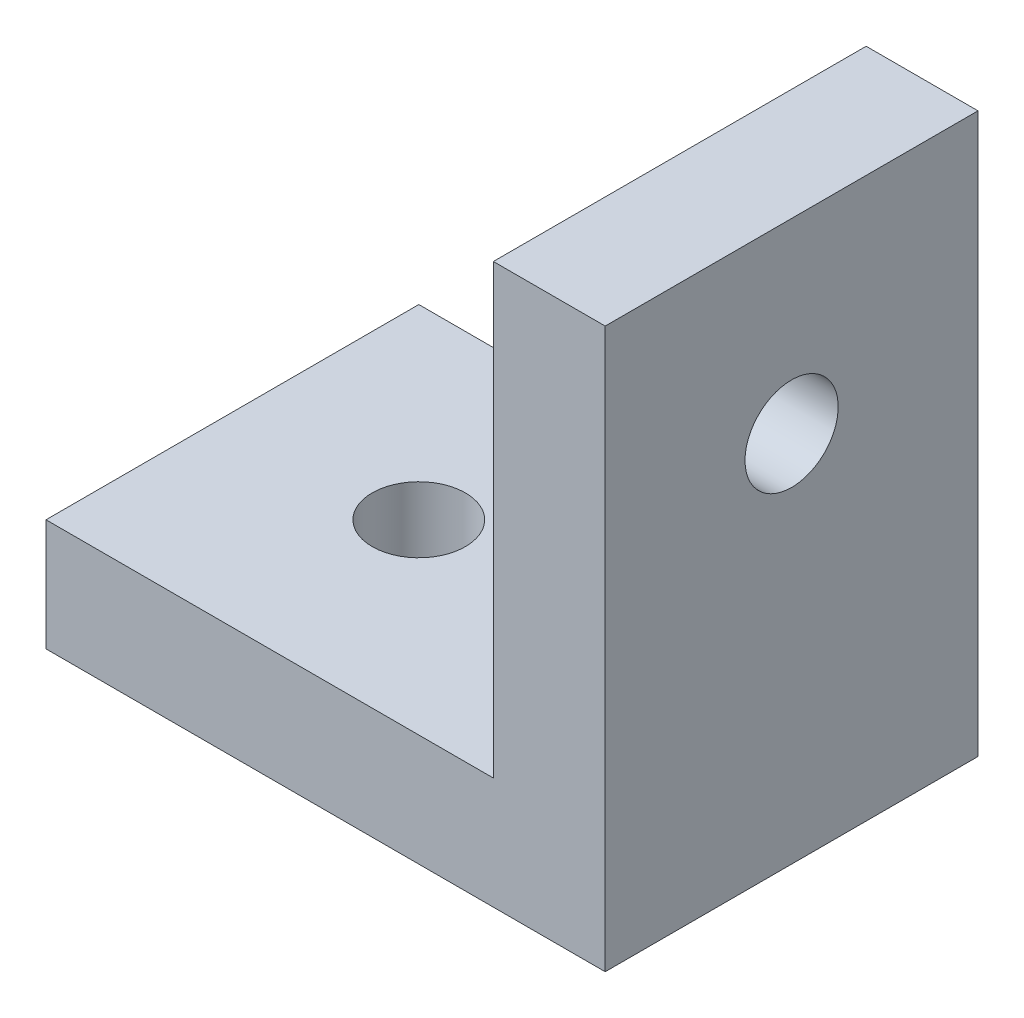
ISO-10303-21;
HEADER;
FILE_DESCRIPTION(('STEP AP214'),'2;1');
FILE_NAME('part.step','',(''),(''),'','','');
FILE_SCHEMA(('AUTOMOTIVE_DESIGN { 1 0 10303 214 1 1 1 1 }'));
ENDSEC;
DATA;
#1=APPLICATION_CONTEXT('core data for automotive mechanical design processes');
#2=APPLICATION_PROTOCOL_DEFINITION('international standard','automotive_design',2000,#1);
#3=PRODUCT_CONTEXT('',#1,'mechanical');
#4=PRODUCT('Part','Part','',(#3));
#5=PRODUCT_RELATED_PRODUCT_CATEGORY('part','',(#4));
#6=PRODUCT_DEFINITION_FORMATION('','',#4);
#7=PRODUCT_DEFINITION_CONTEXT('part definition',#1,'design');
#8=PRODUCT_DEFINITION('design','',#6,#7);
#9=PRODUCT_DEFINITION_SHAPE('','',#8);
#10=(LENGTH_UNIT() NAMED_UNIT(*) SI_UNIT(.MILLI.,.METRE.));
#11=(NAMED_UNIT(*) PLANE_ANGLE_UNIT() SI_UNIT($,.RADIAN.));
#12=(NAMED_UNIT(*) SI_UNIT($,.STERADIAN.) SOLID_ANGLE_UNIT());
#13=UNCERTAINTY_MEASURE_WITH_UNIT(LENGTH_MEASURE(1.E-05),#10,'distance_accuracy_value','');
#14=(GEOMETRIC_REPRESENTATION_CONTEXT(3) GLOBAL_UNCERTAINTY_ASSIGNED_CONTEXT((#13)) GLOBAL_UNIT_ASSIGNED_CONTEXT((#10,
#11,#12)) REPRESENTATION_CONTEXT('',''));
#15=CARTESIAN_POINT('',(0.,0.,0.));
#16=DIRECTION('',(0.,0.,1.));
#17=DIRECTION('',(1.,0.,0.));
#18=AXIS2_PLACEMENT_3D('',#15,#16,#17);
#19=CARTESIAN_POINT('',(7.5,3.,-5.));
#20=DIRECTION('',(-1.,0.,0.));
#21=DIRECTION('',(0.,0.,1.));
#22=AXIS2_PLACEMENT_3D('',#19,#20,#21);
#23=PLANE('',#22);
#24=CARTESIAN_POINT('',(7.5,10.,0.));
#25=DIRECTION('',(-1.,0.,0.));
#26=DIRECTION('',(0.,0.,1.));
#27=AXIS2_PLACEMENT_3D('',#24,#25,#26);
#28=CIRCLE('',#27,1.25);
#29=CARTESIAN_POINT('',(7.5,10.,1.25));
#30=VERTEX_POINT('',#29);
#31=EDGE_CURVE('E166',#30,#30,#28,.T.);
#32=ORIENTED_EDGE('',*,*,#31,.T.);
#33=EDGE_LOOP('',(#32));
#34=FACE_BOUND('',#33,.T.);
#35=DIRECTION('',(0.,0.,-1.));
#36=VECTOR('',#35,1.);
#37=CARTESIAN_POINT('',(7.5,0.,-5.));
#38=LINE('',#37,#36);
#39=CARTESIAN_POINT('',(7.5,0.,5.));
#40=VERTEX_POINT('',#39);
#41=CARTESIAN_POINT('',(7.5,0.,-5.));
#42=VERTEX_POINT('',#41);
#43=EDGE_CURVE('E94',#40,#42,#38,.T.);
#44=ORIENTED_EDGE('',*,*,#43,.T.);
#45=DIRECTION('',(0.,-1.,0.));
#46=VECTOR('',#45,1.);
#47=CARTESIAN_POINT('',(7.5,3.,-5.));
#48=LINE('',#47,#46);
#49=CARTESIAN_POINT('',(7.5,15.,-5.));
#50=VERTEX_POINT('',#49);
#51=EDGE_CURVE('E11',#50,#42,#48,.T.);
#52=ORIENTED_EDGE('',*,*,#51,.F.);
#53=DIRECTION('',(0.,0.,-1.));
#54=VECTOR('',#53,1.);
#55=CARTESIAN_POINT('',(7.5,15.,-5.));
#56=LINE('',#55,#54);
#57=CARTESIAN_POINT('',(7.5,15.,5.));
#58=VERTEX_POINT('',#57);
#59=EDGE_CURVE('E96',#58,#50,#56,.T.);
#60=ORIENTED_EDGE('',*,*,#59,.F.);
#61=DIRECTION('',(0.,-1.,0.));
#62=VECTOR('',#61,1.);
#63=CARTESIAN_POINT('',(7.5,3.,5.));
#64=LINE('',#63,#62);
#65=EDGE_CURVE('E80',#58,#40,#64,.T.);
#66=ORIENTED_EDGE('',*,*,#65,.T.);
#67=EDGE_LOOP('',(#44,#52,#60,#66));
#68=FACE_BOUND('',#67,.T.);
#69=ADVANCED_FACE('F36',(#34,#68),#23,.F.);
#70=CARTESIAN_POINT('',(-7.5,3.,-5.));
#71=DIRECTION('',(0.,0.,1.));
#72=DIRECTION('',(1.,0.,0.));
#73=AXIS2_PLACEMENT_3D('',#70,#71,#72);
#74=PLANE('',#73);
#75=DIRECTION('',(-1.,0.,0.));
#76=VECTOR('',#75,1.);
#77=CARTESIAN_POINT('',(-7.5,0.,-5.));
#78=LINE('',#77,#76);
#79=CARTESIAN_POINT('',(-7.5,0.,-5.));
#80=VERTEX_POINT('',#79);
#81=EDGE_CURVE('E100',#42,#80,#78,.T.);
#82=ORIENTED_EDGE('',*,*,#81,.T.);
#83=DIRECTION('',(0.,-1.,0.));
#84=VECTOR('',#83,1.);
#85=CARTESIAN_POINT('',(-7.5,3.,-5.));
#86=LINE('',#85,#84);
#87=CARTESIAN_POINT('',(-7.5,3.,-5.));
#88=VERTEX_POINT('',#87);
#89=EDGE_CURVE('E43',#88,#80,#86,.T.);
#90=ORIENTED_EDGE('',*,*,#89,.F.);
#91=DIRECTION('',(-1.,0.,0.));
#92=VECTOR('',#91,1.);
#93=CARTESIAN_POINT('',(-7.5,3.,-5.));
#94=LINE('',#93,#92);
#95=CARTESIAN_POINT('',(4.5,3.,-5.));
#96=VERTEX_POINT('',#95);
#97=EDGE_CURVE('E87',#96,#88,#94,.T.);
#98=ORIENTED_EDGE('',*,*,#97,.F.);
#99=DIRECTION('',(0.,-1.,0.));
#100=VECTOR('',#99,1.);
#101=CARTESIAN_POINT('',(4.5,15.,-5.));
#102=LINE('',#101,#100);
#103=CARTESIAN_POINT('',(4.5,15.,-5.));
#104=VERTEX_POINT('',#103);
#105=EDGE_CURVE('E101',#104,#96,#102,.T.);
#106=ORIENTED_EDGE('',*,*,#105,.F.);
#107=DIRECTION('',(-1.,0.,0.));
#108=VECTOR('',#107,1.);
#109=CARTESIAN_POINT('',(7.5,15.,-5.));
#110=LINE('',#109,#108);
#111=EDGE_CURVE('E121',#50,#104,#110,.T.);
#112=ORIENTED_EDGE('',*,*,#111,.F.);
#113=ORIENTED_EDGE('',*,*,#51,.T.);
#114=EDGE_LOOP('',(#82,#90,#98,#106,#112,#113));
#115=FACE_BOUND('',#114,.T.);
#116=ADVANCED_FACE('F116',(#115),#74,.F.);
#117=CARTESIAN_POINT('',(-7.5,3.,-5.));
#118=DIRECTION('',(1.,0.,0.));
#119=DIRECTION('',(0.,0.,-1.));
#120=AXIS2_PLACEMENT_3D('',#117,#118,#119);
#121=PLANE('',#120);
#122=DIRECTION('',(0.,0.,1.));
#123=VECTOR('',#122,1.);
#124=CARTESIAN_POINT('',(-7.5,0.,-5.));
#125=LINE('',#124,#123);
#126=CARTESIAN_POINT('',(-7.5,0.,5.));
#127=VERTEX_POINT('',#126);
#128=EDGE_CURVE('E88',#80,#127,#125,.T.);
#129=ORIENTED_EDGE('',*,*,#128,.T.);
#130=DIRECTION('',(0.,-1.,0.));
#131=VECTOR('',#130,1.);
#132=CARTESIAN_POINT('',(-7.5,3.,5.));
#133=LINE('',#132,#131);
#134=CARTESIAN_POINT('',(-7.5,3.,5.));
#135=VERTEX_POINT('',#134);
#136=EDGE_CURVE('E83',#135,#127,#133,.T.);
#137=ORIENTED_EDGE('',*,*,#136,.F.);
#138=DIRECTION('',(0.,0.,1.));
#139=VECTOR('',#138,1.);
#140=CARTESIAN_POINT('',(-7.5,3.,-5.));
#141=LINE('',#140,#139);
#142=EDGE_CURVE('E56',#88,#135,#141,.T.);
#143=ORIENTED_EDGE('',*,*,#142,.F.);
#144=ORIENTED_EDGE('',*,*,#89,.T.);
#145=EDGE_LOOP('',(#129,#137,#143,#144));
#146=FACE_BOUND('',#145,.T.);
#147=ADVANCED_FACE('F114',(#146),#121,.F.);
#148=CARTESIAN_POINT('',(-7.5,3.,5.));
#149=DIRECTION('',(0.,0.,-1.));
#150=DIRECTION('',(-1.,0.,0.));
#151=AXIS2_PLACEMENT_3D('',#148,#149,#150);
#152=PLANE('',#151);
#153=DIRECTION('',(1.,0.,0.));
#154=VECTOR('',#153,1.);
#155=CARTESIAN_POINT('',(-7.5,0.,5.));
#156=LINE('',#155,#154);
#157=EDGE_CURVE('E76',#127,#40,#156,.T.);
#158=ORIENTED_EDGE('',*,*,#157,.T.);
#159=ORIENTED_EDGE('',*,*,#65,.F.);
#160=DIRECTION('',(1.,0.,0.));
#161=VECTOR('',#160,1.);
#162=CARTESIAN_POINT('',(7.5,15.,5.));
#163=LINE('',#162,#161);
#164=CARTESIAN_POINT('',(4.5,15.,5.));
#165=VERTEX_POINT('',#164);
#166=EDGE_CURVE('E135',#165,#58,#163,.T.);
#167=ORIENTED_EDGE('',*,*,#166,.F.);
#168=DIRECTION('',(0.,-1.,0.));
#169=VECTOR('',#168,1.);
#170=CARTESIAN_POINT('',(4.5,15.,5.));
#171=LINE('',#170,#169);
#172=CARTESIAN_POINT('',(4.5,3.,5.));
#173=VERTEX_POINT('',#172);
#174=EDGE_CURVE('E105',#165,#173,#171,.T.);
#175=ORIENTED_EDGE('',*,*,#174,.T.);
#176=DIRECTION('',(1.,0.,0.));
#177=VECTOR('',#176,1.);
#178=CARTESIAN_POINT('',(-7.5,3.,5.));
#179=LINE('',#178,#177);
#180=EDGE_CURVE('E97',#135,#173,#179,.T.);
#181=ORIENTED_EDGE('',*,*,#180,.F.);
#182=ORIENTED_EDGE('',*,*,#136,.T.);
#183=EDGE_LOOP('',(#158,#159,#167,#175,#181,#182));
#184=FACE_BOUND('',#183,.T.);
#185=ADVANCED_FACE('F78',(#184),#152,.F.);
#186=CARTESIAN_POINT('',(0.,3.,0.));
#187=DIRECTION('',(0.,1.,0.));
#188=DIRECTION('',(0.,0.,1.));
#189=AXIS2_PLACEMENT_3D('',#186,#187,#188);
#190=PLANE('',#189);
#191=CARTESIAN_POINT('',(-2.5,3.,0.));
#192=DIRECTION('',(0.,1.,0.));
#193=DIRECTION('',(0.,0.,1.));
#194=AXIS2_PLACEMENT_3D('',#191,#192,#193);
#195=CIRCLE('',#194,1.24999999999999);
#196=CARTESIAN_POINT('',(-2.5,3.,1.24999999999999));
#197=VERTEX_POINT('',#196);
#198=EDGE_CURVE('E168',#197,#197,#195,.T.);
#199=ORIENTED_EDGE('',*,*,#198,.F.);
#200=EDGE_LOOP('',(#199));
#201=FACE_BOUND('',#200,.T.);
#202=DIRECTION('',(0.,0.,1.));
#203=VECTOR('',#202,1.);
#204=CARTESIAN_POINT('',(4.5,3.,-5.));
#205=LINE('',#204,#203);
#206=EDGE_CURVE('E50',#96,#173,#205,.T.);
#207=ORIENTED_EDGE('',*,*,#206,.F.);
#208=ORIENTED_EDGE('',*,*,#97,.T.);
#209=ORIENTED_EDGE('',*,*,#142,.T.);
#210=ORIENTED_EDGE('',*,*,#180,.T.);
#211=EDGE_LOOP('',(#207,#208,#209,#210));
#212=FACE_BOUND('',#211,.T.);
#213=ADVANCED_FACE('F146',(#201,#212),#190,.T.);
#214=CARTESIAN_POINT('',(0.,0.,0.));
#215=DIRECTION('',(0.,1.,0.));
#216=DIRECTION('',(0.,0.,1.));
#217=AXIS2_PLACEMENT_3D('',#214,#215,#216);
#218=PLANE('',#217);
#219=CARTESIAN_POINT('',(-2.5,0.,0.));
#220=DIRECTION('',(0.,1.,0.));
#221=DIRECTION('',(0.,0.,1.));
#222=AXIS2_PLACEMENT_3D('',#219,#220,#221);
#223=CIRCLE('',#222,1.25);
#224=CARTESIAN_POINT('',(-2.5,0.,1.25));
#225=VERTEX_POINT('',#224);
#226=EDGE_CURVE('E144',#225,#225,#223,.T.);
#227=ORIENTED_EDGE('',*,*,#226,.T.);
#228=EDGE_LOOP('',(#227));
#229=FACE_BOUND('',#228,.T.);
#230=ORIENTED_EDGE('',*,*,#43,.F.);
#231=ORIENTED_EDGE('',*,*,#157,.F.);
#232=ORIENTED_EDGE('',*,*,#128,.F.);
#233=ORIENTED_EDGE('',*,*,#81,.F.);
#234=EDGE_LOOP('',(#230,#231,#232,#233));
#235=FACE_BOUND('',#234,.T.);
#236=ADVANCED_FACE('F99',(#229,#235),#218,.F.);
#237=CARTESIAN_POINT('',(4.5,15.,-5.));
#238=DIRECTION('',(1.,0.,0.));
#239=DIRECTION('',(0.,0.,-1.));
#240=AXIS2_PLACEMENT_3D('',#237,#238,#239);
#241=PLANE('',#240);
#242=CARTESIAN_POINT('',(4.5,10.,0.));
#243=DIRECTION('',(-1.,0.,0.));
#244=DIRECTION('',(0.,0.,1.));
#245=AXIS2_PLACEMENT_3D('',#242,#243,#244);
#246=CIRCLE('',#245,1.24999999999999);
#247=CARTESIAN_POINT('',(4.5,10.,1.24999999999999));
#248=VERTEX_POINT('',#247);
#249=EDGE_CURVE('E169',#248,#248,#246,.T.);
#250=ORIENTED_EDGE('',*,*,#249,.F.);
#251=EDGE_LOOP('',(#250));
#252=FACE_BOUND('',#251,.T.);
#253=ORIENTED_EDGE('',*,*,#206,.T.);
#254=ORIENTED_EDGE('',*,*,#174,.F.);
#255=DIRECTION('',(0.,0.,1.));
#256=VECTOR('',#255,1.);
#257=CARTESIAN_POINT('',(4.5,15.,-5.));
#258=LINE('',#257,#256);
#259=EDGE_CURVE('E132',#104,#165,#258,.T.);
#260=ORIENTED_EDGE('',*,*,#259,.F.);
#261=ORIENTED_EDGE('',*,*,#105,.T.);
#262=EDGE_LOOP('',(#253,#254,#260,#261));
#263=FACE_BOUND('',#262,.T.);
#264=ADVANCED_FACE('F139',(#252,#263),#241,.F.);
#265=CARTESIAN_POINT('',(0.,15.,0.));
#266=DIRECTION('',(0.,-1.,0.));
#267=DIRECTION('',(0.,0.,-1.));
#268=AXIS2_PLACEMENT_3D('',#265,#266,#267);
#269=PLANE('',#268);
#270=ORIENTED_EDGE('',*,*,#59,.T.);
#271=ORIENTED_EDGE('',*,*,#111,.T.);
#272=ORIENTED_EDGE('',*,*,#259,.T.);
#273=ORIENTED_EDGE('',*,*,#166,.T.);
#274=EDGE_LOOP('',(#270,#271,#272,#273));
#275=FACE_BOUND('',#274,.T.);
#276=ADVANCED_FACE('F134',(#275),#269,.F.);
#277=CARTESIAN_POINT('',(-2.5,3.,0.));
#278=DIRECTION('',(0.,1.,0.));
#279=DIRECTION('',(0.,0.,1.));
#280=AXIS2_PLACEMENT_3D('',#277,#278,#279);
#281=CYLINDRICAL_SURFACE('',#280,1.24999999999999);
#282=ORIENTED_EDGE('',*,*,#226,.F.);
#283=EDGE_LOOP('',(#282));
#284=FACE_BOUND('',#283,.T.);
#285=ORIENTED_EDGE('',*,*,#198,.T.);
#286=EDGE_LOOP('',(#285));
#287=FACE_BOUND('',#286,.T.);
#288=ADVANCED_FACE('F180',(#284,#287),#281,.F.);
#289=CARTESIAN_POINT('',(4.5,10.,0.));
#290=DIRECTION('',(-1.,0.,0.));
#291=DIRECTION('',(0.,0.,1.));
#292=AXIS2_PLACEMENT_3D('',#289,#290,#291);
#293=CYLINDRICAL_SURFACE('',#292,1.24999999999999);
#294=ORIENTED_EDGE('',*,*,#31,.F.);
#295=EDGE_LOOP('',(#294));
#296=FACE_BOUND('',#295,.T.);
#297=ORIENTED_EDGE('',*,*,#249,.T.);
#298=EDGE_LOOP('',(#297));
#299=FACE_BOUND('',#298,.T.);
#300=ADVANCED_FACE('F183',(#296,#299),#293,.F.);
#301=CLOSED_SHELL('',(#69,#116,#147,#185,#213,#236,#264,#276,#288,#300));
#302=MANIFOLD_SOLID_BREP('B2',#301);
#303=ADVANCED_BREP_SHAPE_REPRESENTATION('',(#18,#302),#14);
#304=SHAPE_DEFINITION_REPRESENTATION(#9,#303);
ENDSEC;
END-ISO-10303-21;
